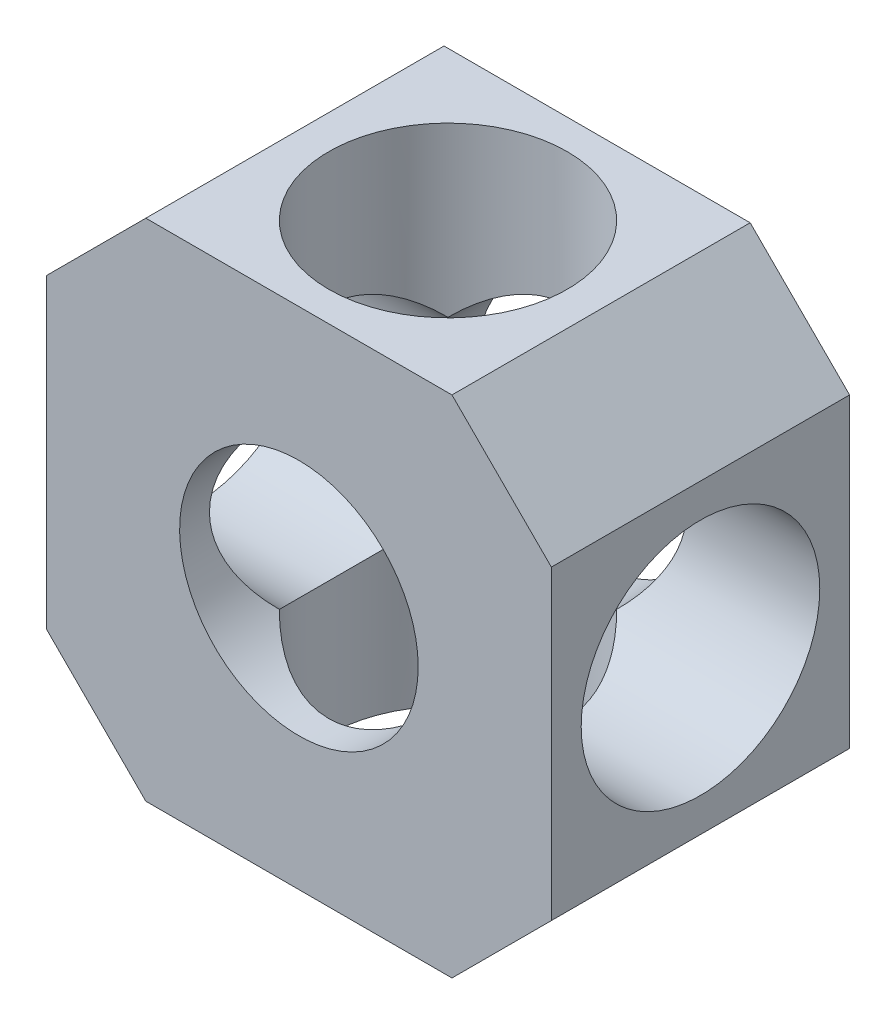
ISO-10303-21;
HEADER;
FILE_DESCRIPTION(('STEP AP214'),'2;1');
FILE_NAME('part.step','',(''),(''),'','','');
FILE_SCHEMA(('AUTOMOTIVE_DESIGN { 1 0 10303 214 1 1 1 1 }'));
ENDSEC;
DATA;
#1=APPLICATION_CONTEXT('core data for automotive mechanical design processes');
#2=APPLICATION_PROTOCOL_DEFINITION('international standard','automotive_design',2000,#1);
#3=PRODUCT_CONTEXT('',#1,'mechanical');
#4=PRODUCT('Part','Part','',(#3));
#5=PRODUCT_RELATED_PRODUCT_CATEGORY('part','',(#4));
#6=PRODUCT_DEFINITION_FORMATION('','',#4);
#7=PRODUCT_DEFINITION_CONTEXT('part definition',#1,'design');
#8=PRODUCT_DEFINITION('design','',#6,#7);
#9=PRODUCT_DEFINITION_SHAPE('','',#8);
#10=(LENGTH_UNIT() NAMED_UNIT(*) SI_UNIT(.MILLI.,.METRE.));
#11=(NAMED_UNIT(*) PLANE_ANGLE_UNIT() SI_UNIT($,.RADIAN.));
#12=(NAMED_UNIT(*) SI_UNIT($,.STERADIAN.) SOLID_ANGLE_UNIT());
#13=UNCERTAINTY_MEASURE_WITH_UNIT(LENGTH_MEASURE(1.E-05),#10,'distance_accuracy_value','');
#14=(GEOMETRIC_REPRESENTATION_CONTEXT(3) GLOBAL_UNCERTAINTY_ASSIGNED_CONTEXT((#13)) GLOBAL_UNIT_ASSIGNED_CONTEXT((#10,
#11,#12)) REPRESENTATION_CONTEXT('',''));
#15=CARTESIAN_POINT('',(0.,0.,0.));
#16=DIRECTION('',(0.,0.,1.));
#17=DIRECTION('',(1.,0.,0.));
#18=AXIS2_PLACEMENT_3D('',#15,#16,#17);
#19=CARTESIAN_POINT('',(0.,0.,15.));
#20=DIRECTION('',(0.,0.,-1.));
#21=DIRECTION('',(-1.,0.,0.));
#22=AXIS2_PLACEMENT_3D('',#19,#20,#21);
#23=CYLINDRICAL_SURFACE('',#22,6.);
#24=CARTESIAN_POINT('',(0.,0.,7.5));
#25=DIRECTION('',(-0.707106781186547,0.,-0.707106781186547));
#26=DIRECTION('',(0.707106781186547,0.,-0.707106781186547));
#27=AXIS2_PLACEMENT_3D('',#24,#25,#26);
#28=ELLIPSE('',#27,8.48528137423856,6.);
#29=CARTESIAN_POINT('',(-4.2426406871193,4.24264068711926,11.7426406871193));
#30=VERTEX_POINT('',#29);
#31=CARTESIAN_POINT('',(-4.24264068711929,-4.24264068711929,11.7426406871193));
#32=VERTEX_POINT('',#31);
#33=EDGE_CURVE('E129',#30,#32,#28,.F.);
#34=ORIENTED_EDGE('',*,*,#33,.F.);
#35=CARTESIAN_POINT('',(0.,0.,7.5));
#36=DIRECTION('',(0.,0.707106781186547,-0.707106781186547));
#37=DIRECTION('',(0.,-0.707106781186547,-0.707106781186547));
#38=AXIS2_PLACEMENT_3D('',#35,#36,#37);
#39=ELLIPSE('',#38,8.48528137423856,6.);
#40=CARTESIAN_POINT('',(4.2426406871193,4.24264068711926,11.7426406871193));
#41=VERTEX_POINT('',#40);
#42=EDGE_CURVE('E136',#41,#30,#39,.F.);
#43=ORIENTED_EDGE('',*,*,#42,.F.);
#44=CARTESIAN_POINT('',(0.,0.,7.5));
#45=DIRECTION('',(0.707106781186547,0.,-0.707106781186547));
#46=DIRECTION('',(-0.707106781186547,0.,-0.707106781186547));
#47=AXIS2_PLACEMENT_3D('',#44,#45,#46);
#48=ELLIPSE('',#47,8.48528137423856,6.);
#49=CARTESIAN_POINT('',(4.24264068711928,-4.24264068711929,11.7426406871193));
#50=VERTEX_POINT('',#49);
#51=EDGE_CURVE('E65',#50,#41,#48,.F.);
#52=ORIENTED_EDGE('',*,*,#51,.F.);
#53=CARTESIAN_POINT('',(0.,0.,7.5));
#54=DIRECTION('',(0.,-0.707106781186547,-0.707106781186547));
#55=DIRECTION('',(0.,0.707106781186547,-0.707106781186547));
#56=AXIS2_PLACEMENT_3D('',#53,#54,#55);
#57=ELLIPSE('',#56,8.48528137423856,6.);
#58=EDGE_CURVE('E142',#32,#50,#57,.F.);
#59=ORIENTED_EDGE('',*,*,#58,.F.);
#60=EDGE_LOOP('',(#34,#43,#52,#59));
#61=FACE_BOUND('',#60,.T.);
#62=CARTESIAN_POINT('',(0.,0.,15.));
#63=DIRECTION('',(0.,0.,1.));
#64=DIRECTION('',(1.,0.,0.));
#65=AXIS2_PLACEMENT_3D('',#62,#63,#64);
#66=CIRCLE('',#65,6.);
#67=CARTESIAN_POINT('',(6.,0.,15.));
#68=VERTEX_POINT('',#67);
#69=EDGE_CURVE('E219',#68,#68,#66,.T.);
#70=ORIENTED_EDGE('',*,*,#69,.T.);
#71=EDGE_LOOP('',(#70));
#72=FACE_BOUND('',#71,.T.);
#73=ADVANCED_FACE('F41',(#61,#72),#23,.F.);
#74=CARTESIAN_POINT('',(0.,0.,15.));
#75=DIRECTION('',(0.,0.,1.));
#76=DIRECTION('',(1.,0.,0.));
#77=AXIS2_PLACEMENT_3D('',#74,#75,#76);
#78=PLANE('',#77);
#79=DIRECTION('',(-1.,0.,0.));
#80=VECTOR('',#79,1.);
#81=CARTESIAN_POINT('',(-7.7,12.7,15.));
#82=LINE('',#81,#80);
#83=CARTESIAN_POINT('',(7.7,12.7,15.));
#84=VERTEX_POINT('',#83);
#85=CARTESIAN_POINT('',(-7.7,12.7,15.));
#86=VERTEX_POINT('',#85);
#87=EDGE_CURVE('E196',#84,#86,#82,.T.);
#88=ORIENTED_EDGE('',*,*,#87,.T.);
#89=DIRECTION('',(-0.707106781186548,-0.707106781186548,0.));
#90=VECTOR('',#89,1.);
#91=CARTESIAN_POINT('',(-12.7,7.7,15.));
#92=LINE('',#91,#90);
#93=CARTESIAN_POINT('',(-12.7,7.7,15.));
#94=VERTEX_POINT('',#93);
#95=EDGE_CURVE('E237',#86,#94,#92,.T.);
#96=ORIENTED_EDGE('',*,*,#95,.T.);
#97=DIRECTION('',(0.,-1.,0.));
#98=VECTOR('',#97,1.);
#99=CARTESIAN_POINT('',(-12.7,-7.7,15.));
#100=LINE('',#99,#98);
#101=CARTESIAN_POINT('',(-12.7,-7.7,15.));
#102=VERTEX_POINT('',#101);
#103=EDGE_CURVE('E234',#94,#102,#100,.T.);
#104=ORIENTED_EDGE('',*,*,#103,.T.);
#105=DIRECTION('',(0.707106781186548,-0.707106781186548,0.));
#106=VECTOR('',#105,1.);
#107=CARTESIAN_POINT('',(-12.7,-7.7,15.));
#108=LINE('',#107,#106);
#109=CARTESIAN_POINT('',(-7.7,-12.7,15.));
#110=VERTEX_POINT('',#109);
#111=EDGE_CURVE('E231',#102,#110,#108,.T.);
#112=ORIENTED_EDGE('',*,*,#111,.T.);
#113=DIRECTION('',(1.,0.,0.));
#114=VECTOR('',#113,1.);
#115=CARTESIAN_POINT('',(-7.7,-12.7,15.));
#116=LINE('',#115,#114);
#117=CARTESIAN_POINT('',(7.7,-12.7,15.));
#118=VERTEX_POINT('',#117);
#119=EDGE_CURVE('E228',#110,#118,#116,.T.);
#120=ORIENTED_EDGE('',*,*,#119,.T.);
#121=DIRECTION('',(0.707106781186548,0.707106781186548,0.));
#122=VECTOR('',#121,1.);
#123=CARTESIAN_POINT('',(7.7,-12.7,15.));
#124=LINE('',#123,#122);
#125=CARTESIAN_POINT('',(12.7,-7.7,15.));
#126=VERTEX_POINT('',#125);
#127=EDGE_CURVE('E225',#118,#126,#124,.T.);
#128=ORIENTED_EDGE('',*,*,#127,.T.);
#129=DIRECTION('',(0.,1.,0.));
#130=VECTOR('',#129,1.);
#131=CARTESIAN_POINT('',(12.7,-7.7,15.));
#132=LINE('',#131,#130);
#133=CARTESIAN_POINT('',(12.7,7.7,15.));
#134=VERTEX_POINT('',#133);
#135=EDGE_CURVE('E222',#126,#134,#132,.T.);
#136=ORIENTED_EDGE('',*,*,#135,.T.);
#137=DIRECTION('',(-0.707106781186548,0.707106781186548,0.));
#138=VECTOR('',#137,1.);
#139=CARTESIAN_POINT('',(12.7,7.7,15.));
#140=LINE('',#139,#138);
#141=EDGE_CURVE('E192',#134,#84,#140,.T.);
#142=ORIENTED_EDGE('',*,*,#141,.T.);
#143=EDGE_LOOP('',(#88,#96,#104,#112,#120,#128,#136,#142));
#144=FACE_BOUND('',#143,.T.);
#145=ORIENTED_EDGE('',*,*,#69,.F.);
#146=EDGE_LOOP('',(#145));
#147=FACE_BOUND('',#146,.T.);
#148=ADVANCED_FACE('F312',(#144,#147),#78,.T.);
#149=CARTESIAN_POINT('',(0.,0.,0.));
#150=DIRECTION('',(0.,0.,1.));
#151=DIRECTION('',(1.,0.,0.));
#152=AXIS2_PLACEMENT_3D('',#149,#150,#151);
#153=PLANE('',#152);
#154=DIRECTION('',(-1.,0.,0.));
#155=VECTOR('',#154,1.);
#156=CARTESIAN_POINT('',(-7.7,12.7,0.));
#157=LINE('',#156,#155);
#158=CARTESIAN_POINT('',(7.7,12.7,0.));
#159=VERTEX_POINT('',#158);
#160=CARTESIAN_POINT('',(-7.7,12.7,0.));
#161=VERTEX_POINT('',#160);
#162=EDGE_CURVE('E215',#159,#161,#157,.T.);
#163=ORIENTED_EDGE('',*,*,#162,.F.);
#164=DIRECTION('',(-0.707106781186548,0.707106781186548,0.));
#165=VECTOR('',#164,1.);
#166=CARTESIAN_POINT('',(12.7,7.7,0.));
#167=LINE('',#166,#165);
#168=CARTESIAN_POINT('',(12.7,7.7,0.));
#169=VERTEX_POINT('',#168);
#170=EDGE_CURVE('E193',#169,#159,#167,.T.);
#171=ORIENTED_EDGE('',*,*,#170,.F.);
#172=DIRECTION('',(0.,1.,0.));
#173=VECTOR('',#172,1.);
#174=CARTESIAN_POINT('',(12.7,-7.7,0.));
#175=LINE('',#174,#173);
#176=CARTESIAN_POINT('',(12.7,-7.7,0.));
#177=VERTEX_POINT('',#176);
#178=EDGE_CURVE('E197',#177,#169,#175,.T.);
#179=ORIENTED_EDGE('',*,*,#178,.F.);
#180=DIRECTION('',(0.707106781186548,0.707106781186548,0.));
#181=VECTOR('',#180,1.);
#182=CARTESIAN_POINT('',(7.7,-12.7,0.));
#183=LINE('',#182,#181);
#184=CARTESIAN_POINT('',(7.7,-12.7,0.));
#185=VERTEX_POINT('',#184);
#186=EDGE_CURVE('E200',#185,#177,#183,.T.);
#187=ORIENTED_EDGE('',*,*,#186,.F.);
#188=DIRECTION('',(1.,0.,0.));
#189=VECTOR('',#188,1.);
#190=CARTESIAN_POINT('',(-7.7,-12.7,0.));
#191=LINE('',#190,#189);
#192=CARTESIAN_POINT('',(-7.7,-12.7,0.));
#193=VERTEX_POINT('',#192);
#194=EDGE_CURVE('E203',#193,#185,#191,.T.);
#195=ORIENTED_EDGE('',*,*,#194,.F.);
#196=DIRECTION('',(0.707106781186548,-0.707106781186548,0.));
#197=VECTOR('',#196,1.);
#198=CARTESIAN_POINT('',(-12.7,-7.7,0.));
#199=LINE('',#198,#197);
#200=CARTESIAN_POINT('',(-12.7,-7.7,0.));
#201=VERTEX_POINT('',#200);
#202=EDGE_CURVE('E206',#201,#193,#199,.T.);
#203=ORIENTED_EDGE('',*,*,#202,.F.);
#204=DIRECTION('',(0.,-1.,0.));
#205=VECTOR('',#204,1.);
#206=CARTESIAN_POINT('',(-12.7,-7.7,0.));
#207=LINE('',#206,#205);
#208=CARTESIAN_POINT('',(-12.7,7.7,0.));
#209=VERTEX_POINT('',#208);
#210=EDGE_CURVE('E209',#209,#201,#207,.T.);
#211=ORIENTED_EDGE('',*,*,#210,.F.);
#212=DIRECTION('',(-0.707106781186548,-0.707106781186548,0.));
#213=VECTOR('',#212,1.);
#214=CARTESIAN_POINT('',(-12.7,7.7,0.));
#215=LINE('',#214,#213);
#216=EDGE_CURVE('E212',#161,#209,#215,.T.);
#217=ORIENTED_EDGE('',*,*,#216,.F.);
#218=EDGE_LOOP('',(#163,#171,#179,#187,#195,#203,#211,#217));
#219=FACE_BOUND('',#218,.T.);
#220=CARTESIAN_POINT('',(0.,0.,0.));
#221=DIRECTION('',(0.,0.,1.));
#222=DIRECTION('',(1.,0.,0.));
#223=AXIS2_PLACEMENT_3D('',#220,#221,#222);
#224=CIRCLE('',#223,6.);
#225=CARTESIAN_POINT('',(6.,0.,0.));
#226=VERTEX_POINT('',#225);
#227=EDGE_CURVE('E243',#226,#226,#224,.T.);
#228=ORIENTED_EDGE('',*,*,#227,.T.);
#229=EDGE_LOOP('',(#228));
#230=FACE_BOUND('',#229,.T.);
#231=ADVANCED_FACE('F298',(#219,#230),#153,.F.);
#232=CARTESIAN_POINT('',(-7.7,12.7,15.));
#233=DIRECTION('',(0.,-1.,0.));
#234=DIRECTION('',(0.,0.,-1.));
#235=AXIS2_PLACEMENT_3D('',#232,#233,#234);
#236=PLANE('',#235);
#237=CARTESIAN_POINT('',(0.,12.7,7.5));
#238=DIRECTION('',(0.,1.,0.));
#239=DIRECTION('',(0.,0.,1.));
#240=AXIS2_PLACEMENT_3D('',#237,#238,#239);
#241=CIRCLE('',#240,5.99999999999999);
#242=CARTESIAN_POINT('',(0.,12.7,13.5));
#243=VERTEX_POINT('',#242);
#244=EDGE_CURVE('E254',#243,#243,#241,.T.);
#245=ORIENTED_EDGE('',*,*,#244,.F.);
#246=EDGE_LOOP('',(#245));
#247=FACE_BOUND('',#246,.T.);
#248=ORIENTED_EDGE('',*,*,#162,.T.);
#249=DIRECTION('',(0.,0.,-1.));
#250=VECTOR('',#249,1.);
#251=CARTESIAN_POINT('',(-7.7,12.7,15.));
#252=LINE('',#251,#250);
#253=EDGE_CURVE('E160',#86,#161,#252,.T.);
#254=ORIENTED_EDGE('',*,*,#253,.F.);
#255=ORIENTED_EDGE('',*,*,#87,.F.);
#256=DIRECTION('',(0.,0.,-1.));
#257=VECTOR('',#256,1.);
#258=CARTESIAN_POINT('',(7.7,12.7,15.));
#259=LINE('',#258,#257);
#260=EDGE_CURVE('E188',#84,#159,#259,.T.);
#261=ORIENTED_EDGE('',*,*,#260,.T.);
#262=EDGE_LOOP('',(#248,#254,#255,#261));
#263=FACE_BOUND('',#262,.T.);
#264=ADVANCED_FACE('F43',(#247,#263),#236,.F.);
#265=CARTESIAN_POINT('',(-12.7,7.7,15.));
#266=DIRECTION('',(0.707106781186547,-0.707106781186547,0.));
#267=DIRECTION('',(0.707106781186548,0.707106781186548,0.));
#268=AXIS2_PLACEMENT_3D('',#265,#266,#267);
#269=PLANE('',#268);
#270=ORIENTED_EDGE('',*,*,#216,.T.);
#271=DIRECTION('',(0.,0.,-1.));
#272=VECTOR('',#271,1.);
#273=CARTESIAN_POINT('',(-12.7,7.7,15.));
#274=LINE('',#273,#272);
#275=EDGE_CURVE('E164',#94,#209,#274,.T.);
#276=ORIENTED_EDGE('',*,*,#275,.F.);
#277=ORIENTED_EDGE('',*,*,#95,.F.);
#278=ORIENTED_EDGE('',*,*,#253,.T.);
#279=EDGE_LOOP('',(#270,#276,#277,#278));
#280=FACE_BOUND('',#279,.T.);
#281=ADVANCED_FACE('F285',(#280),#269,.F.);
#282=CARTESIAN_POINT('',(-12.7,-7.7,15.));
#283=DIRECTION('',(1.,0.,0.));
#284=DIRECTION('',(0.,0.,-1.));
#285=AXIS2_PLACEMENT_3D('',#282,#283,#284);
#286=PLANE('',#285);
#287=CARTESIAN_POINT('',(-12.7,0.,7.5));
#288=DIRECTION('',(-1.,0.,0.));
#289=DIRECTION('',(0.,0.,1.));
#290=AXIS2_PLACEMENT_3D('',#287,#288,#289);
#291=CIRCLE('',#290,5.99999999999999);
#292=CARTESIAN_POINT('',(-12.7,0.,13.5));
#293=VERTEX_POINT('',#292);
#294=EDGE_CURVE('E275',#293,#293,#291,.T.);
#295=ORIENTED_EDGE('',*,*,#294,.F.);
#296=EDGE_LOOP('',(#295));
#297=FACE_BOUND('',#296,.T.);
#298=ORIENTED_EDGE('',*,*,#210,.T.);
#299=DIRECTION('',(0.,0.,-1.));
#300=VECTOR('',#299,1.);
#301=CARTESIAN_POINT('',(-12.7,-7.7,15.));
#302=LINE('',#301,#300);
#303=EDGE_CURVE('E168',#102,#201,#302,.T.);
#304=ORIENTED_EDGE('',*,*,#303,.F.);
#305=ORIENTED_EDGE('',*,*,#103,.F.);
#306=ORIENTED_EDGE('',*,*,#275,.T.);
#307=EDGE_LOOP('',(#298,#304,#305,#306));
#308=FACE_BOUND('',#307,.T.);
#309=ADVANCED_FACE('F281',(#297,#308),#286,.F.);
#310=CARTESIAN_POINT('',(-12.7,-7.7,15.));
#311=DIRECTION('',(0.707106781186547,0.707106781186547,0.));
#312=DIRECTION('',(-0.707106781186548,0.707106781186548,0.));
#313=AXIS2_PLACEMENT_3D('',#310,#311,#312);
#314=PLANE('',#313);
#315=ORIENTED_EDGE('',*,*,#202,.T.);
#316=DIRECTION('',(0.,0.,-1.));
#317=VECTOR('',#316,1.);
#318=CARTESIAN_POINT('',(-7.7,-12.7,15.));
#319=LINE('',#318,#317);
#320=EDGE_CURVE('E172',#110,#193,#319,.T.);
#321=ORIENTED_EDGE('',*,*,#320,.F.);
#322=ORIENTED_EDGE('',*,*,#111,.F.);
#323=ORIENTED_EDGE('',*,*,#303,.T.);
#324=EDGE_LOOP('',(#315,#321,#322,#323));
#325=FACE_BOUND('',#324,.T.);
#326=ADVANCED_FACE('F284',(#325),#314,.F.);
#327=CARTESIAN_POINT('',(-7.7,-12.7,15.));
#328=DIRECTION('',(0.,1.,0.));
#329=DIRECTION('',(0.,0.,1.));
#330=AXIS2_PLACEMENT_3D('',#327,#328,#329);
#331=PLANE('',#330);
#332=CARTESIAN_POINT('',(0.,-12.7,7.5));
#333=DIRECTION('',(0.,1.,0.));
#334=DIRECTION('',(0.,0.,1.));
#335=AXIS2_PLACEMENT_3D('',#332,#333,#334);
#336=CIRCLE('',#335,5.99999999999999);
#337=CARTESIAN_POINT('',(0.,-12.7,13.5));
#338=VERTEX_POINT('',#337);
#339=EDGE_CURVE('E247',#338,#338,#336,.T.);
#340=ORIENTED_EDGE('',*,*,#339,.T.);
#341=EDGE_LOOP('',(#340));
#342=FACE_BOUND('',#341,.T.);
#343=ORIENTED_EDGE('',*,*,#194,.T.);
#344=DIRECTION('',(0.,0.,-1.));
#345=VECTOR('',#344,1.);
#346=CARTESIAN_POINT('',(7.7,-12.7,15.));
#347=LINE('',#346,#345);
#348=EDGE_CURVE('E176',#118,#185,#347,.T.);
#349=ORIENTED_EDGE('',*,*,#348,.F.);
#350=ORIENTED_EDGE('',*,*,#119,.F.);
#351=ORIENTED_EDGE('',*,*,#320,.T.);
#352=EDGE_LOOP('',(#343,#349,#350,#351));
#353=FACE_BOUND('',#352,.T.);
#354=ADVANCED_FACE('F304',(#342,#353),#331,.F.);
#355=CARTESIAN_POINT('',(7.7,-12.7,15.));
#356=DIRECTION('',(-0.707106781186547,0.707106781186547,0.));
#357=DIRECTION('',(-0.707106781186548,-0.707106781186548,0.));
#358=AXIS2_PLACEMENT_3D('',#355,#356,#357);
#359=PLANE('',#358);
#360=ORIENTED_EDGE('',*,*,#186,.T.);
#361=DIRECTION('',(0.,0.,-1.));
#362=VECTOR('',#361,1.);
#363=CARTESIAN_POINT('',(12.7,-7.7,15.));
#364=LINE('',#363,#362);
#365=EDGE_CURVE('E180',#126,#177,#364,.T.);
#366=ORIENTED_EDGE('',*,*,#365,.F.);
#367=ORIENTED_EDGE('',*,*,#127,.F.);
#368=ORIENTED_EDGE('',*,*,#348,.T.);
#369=EDGE_LOOP('',(#360,#366,#367,#368));
#370=FACE_BOUND('',#369,.T.);
#371=ADVANCED_FACE('F308',(#370),#359,.F.);
#372=CARTESIAN_POINT('',(12.7,-7.7,15.));
#373=DIRECTION('',(-1.,0.,0.));
#374=DIRECTION('',(0.,0.,1.));
#375=AXIS2_PLACEMENT_3D('',#372,#373,#374);
#376=PLANE('',#375);
#377=CARTESIAN_POINT('',(12.7,0.,7.5));
#378=DIRECTION('',(-1.,0.,0.));
#379=DIRECTION('',(0.,0.,1.));
#380=AXIS2_PLACEMENT_3D('',#377,#378,#379);
#381=CIRCLE('',#380,5.99999999999999);
#382=CARTESIAN_POINT('',(12.7,0.,13.5));
#383=VERTEX_POINT('',#382);
#384=EDGE_CURVE('E258',#383,#383,#381,.T.);
#385=ORIENTED_EDGE('',*,*,#384,.T.);
#386=EDGE_LOOP('',(#385));
#387=FACE_BOUND('',#386,.T.);
#388=ORIENTED_EDGE('',*,*,#178,.T.);
#389=DIRECTION('',(0.,0.,-1.));
#390=VECTOR('',#389,1.);
#391=CARTESIAN_POINT('',(12.7,7.7,15.));
#392=LINE('',#391,#390);
#393=EDGE_CURVE('E184',#134,#169,#392,.T.);
#394=ORIENTED_EDGE('',*,*,#393,.F.);
#395=ORIENTED_EDGE('',*,*,#135,.F.);
#396=ORIENTED_EDGE('',*,*,#365,.T.);
#397=EDGE_LOOP('',(#388,#394,#395,#396));
#398=FACE_BOUND('',#397,.T.);
#399=ADVANCED_FACE('F325',(#387,#398),#376,.F.);
#400=CARTESIAN_POINT('',(12.7,7.7,15.));
#401=DIRECTION('',(-0.707106781186547,-0.707106781186547,0.));
#402=DIRECTION('',(0.707106781186548,-0.707106781186548,0.));
#403=AXIS2_PLACEMENT_3D('',#400,#401,#402);
#404=PLANE('',#403);
#405=ORIENTED_EDGE('',*,*,#170,.T.);
#406=ORIENTED_EDGE('',*,*,#260,.F.);
#407=ORIENTED_EDGE('',*,*,#141,.F.);
#408=ORIENTED_EDGE('',*,*,#393,.T.);
#409=EDGE_LOOP('',(#405,#406,#407,#408));
#410=FACE_BOUND('',#409,.T.);
#411=ADVANCED_FACE('F323',(#410),#404,.F.);
#412=CARTESIAN_POINT('',(0.,0.,7.5));
#413=DIRECTION('',(-0.707106781186547,0.,-0.707106781186547));
#414=DIRECTION('',(0.707106781186547,0.,-0.707106781186547));
#415=AXIS2_PLACEMENT_3D('',#412,#413,#414);
#416=ELLIPSE('',#415,8.48528137423856,6.);
#417=CARTESIAN_POINT('',(4.2426406871193,4.24264068711926,3.25735931288074));
#418=VERTEX_POINT('',#417);
#419=CARTESIAN_POINT('',(4.24264068711928,-4.24264068711929,3.25735931288071));
#420=VERTEX_POINT('',#419);
#421=EDGE_CURVE('E268',#418,#420,#416,.T.);
#422=ORIENTED_EDGE('',*,*,#421,.F.);
#423=CARTESIAN_POINT('',(0.,0.,7.5));
#424=DIRECTION('',(0.,-0.707106781186547,-0.707106781186547));
#425=DIRECTION('',(0.,0.707106781186547,-0.707106781186547));
#426=AXIS2_PLACEMENT_3D('',#423,#424,#425);
#427=ELLIPSE('',#426,8.48528137423856,6.);
#428=CARTESIAN_POINT('',(-4.2426406871193,4.24264068711926,3.25735931288074));
#429=VERTEX_POINT('',#428);
#430=EDGE_CURVE('E153',#429,#418,#427,.T.);
#431=ORIENTED_EDGE('',*,*,#430,.F.);
#432=CARTESIAN_POINT('',(0.,0.,7.5));
#433=DIRECTION('',(0.707106781186547,0.,-0.707106781186547));
#434=DIRECTION('',(-0.707106781186547,0.,-0.707106781186547));
#435=AXIS2_PLACEMENT_3D('',#432,#433,#434);
#436=ELLIPSE('',#435,8.48528137423856,6.);
#437=CARTESIAN_POINT('',(-4.24264068711929,-4.24264068711929,3.25735931288071));
#438=VERTEX_POINT('',#437);
#439=EDGE_CURVE('E57',#438,#429,#436,.T.);
#440=ORIENTED_EDGE('',*,*,#439,.F.);
#441=CARTESIAN_POINT('',(0.,0.,7.5));
#442=DIRECTION('',(0.,0.707106781186547,-0.707106781186547));
#443=DIRECTION('',(0.,-0.707106781186547,-0.707106781186547));
#444=AXIS2_PLACEMENT_3D('',#441,#442,#443);
#445=ELLIPSE('',#444,8.48528137423856,6.);
#446=EDGE_CURVE('E149',#420,#438,#445,.T.);
#447=ORIENTED_EDGE('',*,*,#446,.F.);
#448=EDGE_LOOP('',(#422,#431,#440,#447));
#449=FACE_BOUND('',#448,.T.);
#450=ORIENTED_EDGE('',*,*,#227,.F.);
#451=EDGE_LOOP('',(#450));
#452=FACE_BOUND('',#451,.T.);
#453=ADVANCED_FACE('F333',(#449,#452),#23,.F.);
#454=CARTESIAN_POINT('',(0.,12.7,7.5));
#455=DIRECTION('',(0.,1.,0.));
#456=DIRECTION('',(0.,0.,1.));
#457=AXIS2_PLACEMENT_3D('',#454,#455,#456);
#458=CYLINDRICAL_SURFACE('',#457,5.99999999999999);
#459=ORIENTED_EDGE('',*,*,#446,.T.);
#460=CARTESIAN_POINT('',(0.,0.,7.5));
#461=DIRECTION('',(-0.707106781186547,0.707106781186547,0.));
#462=DIRECTION('',(0.707106781186547,0.707106781186547,0.));
#463=AXIS2_PLACEMENT_3D('',#460,#461,#462);
#464=ELLIPSE('',#463,8.48528137423856,5.99999999999999);
#465=EDGE_CURVE('E144',#438,#32,#464,.T.);
#466=ORIENTED_EDGE('',*,*,#465,.T.);
#467=ORIENTED_EDGE('',*,*,#58,.T.);
#468=CARTESIAN_POINT('',(0.,0.,7.5));
#469=DIRECTION('',(0.707106781186547,0.707106781186547,0.));
#470=DIRECTION('',(-0.707106781186547,0.707106781186547,0.));
#471=AXIS2_PLACEMENT_3D('',#468,#469,#470);
#472=ELLIPSE('',#471,8.48528137423856,5.99999999999999);
#473=EDGE_CURVE('E262',#50,#420,#472,.T.);
#474=ORIENTED_EDGE('',*,*,#473,.T.);
#475=EDGE_LOOP('',(#459,#466,#467,#474));
#476=FACE_BOUND('',#475,.T.);
#477=ORIENTED_EDGE('',*,*,#339,.F.);
#478=EDGE_LOOP('',(#477));
#479=FACE_BOUND('',#478,.T.);
#480=ADVANCED_FACE('F344',(#476,#479),#458,.F.);
#481=ORIENTED_EDGE('',*,*,#430,.T.);
#482=CARTESIAN_POINT('',(0.,0.,7.5));
#483=DIRECTION('',(-0.707106781186547,0.707106781186547,0.));
#484=DIRECTION('',(0.707106781186547,0.707106781186547,0.));
#485=AXIS2_PLACEMENT_3D('',#482,#483,#484);
#486=ELLIPSE('',#485,8.48528137423856,5.99999999999999);
#487=EDGE_CURVE('E11',#418,#41,#486,.F.);
#488=ORIENTED_EDGE('',*,*,#487,.T.);
#489=ORIENTED_EDGE('',*,*,#42,.T.);
#490=CARTESIAN_POINT('',(0.,0.,7.5));
#491=DIRECTION('',(0.707106781186547,0.707106781186547,0.));
#492=DIRECTION('',(-0.707106781186547,0.707106781186547,0.));
#493=AXIS2_PLACEMENT_3D('',#490,#491,#492);
#494=ELLIPSE('',#493,8.48528137423856,5.99999999999999);
#495=EDGE_CURVE('E50',#30,#429,#494,.F.);
#496=ORIENTED_EDGE('',*,*,#495,.T.);
#497=EDGE_LOOP('',(#481,#488,#489,#496));
#498=FACE_BOUND('',#497,.T.);
#499=ORIENTED_EDGE('',*,*,#244,.T.);
#500=EDGE_LOOP('',(#499));
#501=FACE_BOUND('',#500,.T.);
#502=ADVANCED_FACE('F146',(#498,#501),#458,.F.);
#503=CARTESIAN_POINT('',(-12.7,0.,7.5));
#504=DIRECTION('',(-1.,0.,0.));
#505=DIRECTION('',(0.,0.,1.));
#506=AXIS2_PLACEMENT_3D('',#503,#504,#505);
#507=CYLINDRICAL_SURFACE('',#506,5.99999999999999);
#508=ORIENTED_EDGE('',*,*,#294,.T.);
#509=EDGE_LOOP('',(#508));
#510=FACE_BOUND('',#509,.T.);
#511=ORIENTED_EDGE('',*,*,#439,.T.);
#512=ORIENTED_EDGE('',*,*,#495,.F.);
#513=ORIENTED_EDGE('',*,*,#33,.T.);
#514=ORIENTED_EDGE('',*,*,#465,.F.);
#515=EDGE_LOOP('',(#511,#512,#513,#514));
#516=FACE_BOUND('',#515,.T.);
#517=ADVANCED_FACE('F128',(#510,#516),#507,.F.);
#518=ORIENTED_EDGE('',*,*,#51,.T.);
#519=ORIENTED_EDGE('',*,*,#487,.F.);
#520=ORIENTED_EDGE('',*,*,#421,.T.);
#521=ORIENTED_EDGE('',*,*,#473,.F.);
#522=EDGE_LOOP('',(#518,#519,#520,#521));
#523=FACE_BOUND('',#522,.T.);
#524=ORIENTED_EDGE('',*,*,#384,.F.);
#525=EDGE_LOOP('',(#524));
#526=FACE_BOUND('',#525,.T.);
#527=ADVANCED_FACE('F368',(#523,#526),#507,.F.);
#528=CLOSED_SHELL('',(#73,#148,#231,#264,#281,#309,#326,#354,#371,#399,#411,#453,#480,#502,#517,#527));
#529=MANIFOLD_SOLID_BREP('B2',#528);
#530=ADVANCED_BREP_SHAPE_REPRESENTATION('',(#18,#529),#14);
#531=SHAPE_DEFINITION_REPRESENTATION(#9,#530);
ENDSEC;
END-ISO-10303-21;
